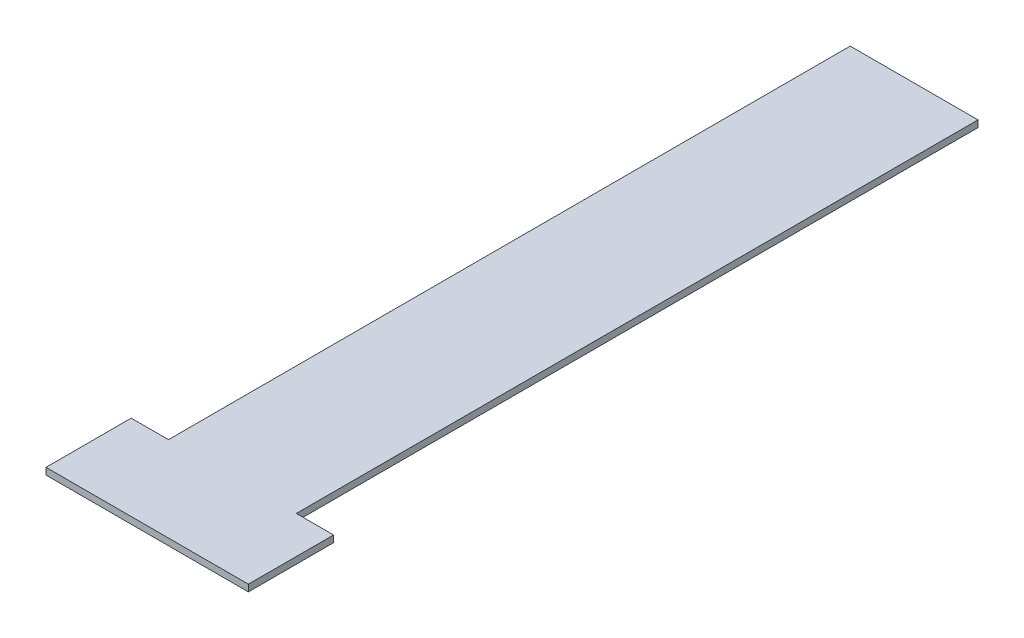
ISO-10303-21;
HEADER;
FILE_DESCRIPTION(('STEP AP214'),'2;1');
FILE_NAME('part.step','',(''),(''),'','','');
FILE_SCHEMA(('AUTOMOTIVE_DESIGN { 1 0 10303 214 1 1 1 1 }'));
ENDSEC;
DATA;
#1=APPLICATION_CONTEXT('core data for automotive mechanical design processes');
#2=APPLICATION_PROTOCOL_DEFINITION('international standard','automotive_design',2000,#1);
#3=PRODUCT_CONTEXT('',#1,'mechanical');
#4=PRODUCT('Part','Part','',(#3));
#5=PRODUCT_RELATED_PRODUCT_CATEGORY('part','',(#4));
#6=PRODUCT_DEFINITION_FORMATION('','',#4);
#7=PRODUCT_DEFINITION_CONTEXT('part definition',#1,'design');
#8=PRODUCT_DEFINITION('design','',#6,#7);
#9=PRODUCT_DEFINITION_SHAPE('','',#8);
#10=(LENGTH_UNIT() NAMED_UNIT(*) SI_UNIT(.MILLI.,.METRE.));
#11=(NAMED_UNIT(*) PLANE_ANGLE_UNIT() SI_UNIT($,.RADIAN.));
#12=(NAMED_UNIT(*) SI_UNIT($,.STERADIAN.) SOLID_ANGLE_UNIT());
#13=UNCERTAINTY_MEASURE_WITH_UNIT(LENGTH_MEASURE(1.E-05),#10,'distance_accuracy_value','');
#14=(GEOMETRIC_REPRESENTATION_CONTEXT(3) GLOBAL_UNCERTAINTY_ASSIGNED_CONTEXT((#13)) GLOBAL_UNIT_ASSIGNED_CONTEXT((#10,
#11,#12)) REPRESENTATION_CONTEXT('',''));
#15=CARTESIAN_POINT('',(0.,0.,0.));
#16=DIRECTION('',(0.,0.,1.));
#17=DIRECTION('',(1.,0.,0.));
#18=AXIS2_PLACEMENT_3D('',#15,#16,#17);
#19=CARTESIAN_POINT('',(-5.31079537855206,2.,5.04264705882353));
#20=DIRECTION('',(0.,0.,-1.));
#21=DIRECTION('',(1.,0.,0.));
#22=AXIS2_PLACEMENT_3D('',#19,#20,#21);
#23=PLANE('',#22);
#24=DIRECTION('',(1.,0.,0.));
#25=VECTOR('',#24,1.);
#26=CARTESIAN_POINT('',(-5.31079537855206,2.,5.04264705882353));
#27=LINE('',#26,#25);
#28=CARTESIAN_POINT('',(-40.2357953785521,2.,5.04264705882353));
#29=VERTEX_POINT('',#28);
#30=CARTESIAN_POINT('',(20.0892046214479,2.,5.04264705882353));
#31=VERTEX_POINT('',#30);
#32=EDGE_CURVE('E106',#29,#31,#27,.T.);
#33=ORIENTED_EDGE('',*,*,#32,.F.);
#34=DIRECTION('',(0.,1.,0.));
#35=VECTOR('',#34,1.);
#36=CARTESIAN_POINT('',(-40.2357953785521,0.,5.04264705882353));
#37=LINE('',#36,#35);
#38=CARTESIAN_POINT('',(-40.2357953785521,0.,5.04264705882353));
#39=VERTEX_POINT('',#38);
#40=EDGE_CURVE('E145',#39,#29,#37,.T.);
#41=ORIENTED_EDGE('',*,*,#40,.F.);
#42=DIRECTION('',(1.,0.,0.));
#43=VECTOR('',#42,1.);
#44=CARTESIAN_POINT('',(0.,0.,5.04264705882352));
#45=LINE('',#44,#43);
#46=CARTESIAN_POINT('',(20.0892046214479,0.,5.04264705882353));
#47=VERTEX_POINT('',#46);
#48=EDGE_CURVE('E82',#39,#47,#45,.T.);
#49=ORIENTED_EDGE('',*,*,#48,.T.);
#50=DIRECTION('',(0.,1.,0.));
#51=VECTOR('',#50,1.);
#52=CARTESIAN_POINT('',(20.0892046214479,0.,5.04264705882353));
#53=LINE('',#52,#51);
#54=EDGE_CURVE('E133',#47,#31,#53,.T.);
#55=ORIENTED_EDGE('',*,*,#54,.T.);
#56=EDGE_LOOP('',(#33,#41,#49,#55));
#57=FACE_BOUND('',#56,.T.);
#58=ADVANCED_FACE('F39',(#57),#23,.F.);
#59=CARTESIAN_POINT('',(8.97670462144793,2.,-223.557352941176));
#60=DIRECTION('',(-1.,0.,0.));
#61=DIRECTION('',(0.,0.,-1.));
#62=AXIS2_PLACEMENT_3D('',#59,#60,#61);
#63=PLANE('',#62);
#64=DIRECTION('',(0.,1.,0.));
#65=VECTOR('',#64,1.);
#66=CARTESIAN_POINT('',(8.97670462144793,2.,-20.3573529411765));
#67=LINE('',#66,#65);
#68=CARTESIAN_POINT('',(8.97670462144793,0.,-20.3573529411765));
#69=VERTEX_POINT('',#68);
#70=CARTESIAN_POINT('',(8.97670462144793,2.,-20.3573529411765));
#71=VERTEX_POINT('',#70);
#72=EDGE_CURVE('E11',#69,#71,#67,.T.);
#73=ORIENTED_EDGE('',*,*,#72,.F.);
#74=DIRECTION('',(0.,0.,-1.));
#75=VECTOR('',#74,1.);
#76=CARTESIAN_POINT('',(8.97670462144793,0.,0.));
#77=LINE('',#76,#75);
#78=CARTESIAN_POINT('',(8.97670462144793,0.,-223.557352941176));
#79=VERTEX_POINT('',#78);
#80=EDGE_CURVE('E158',#69,#79,#77,.T.);
#81=ORIENTED_EDGE('',*,*,#80,.T.);
#82=DIRECTION('',(0.,1.,0.));
#83=VECTOR('',#82,1.);
#84=CARTESIAN_POINT('',(8.97670462144793,2.,-223.557352941176));
#85=LINE('',#84,#83);
#86=CARTESIAN_POINT('',(8.97670462144793,2.,-223.557352941176));
#87=VERTEX_POINT('',#86);
#88=EDGE_CURVE('E48',#79,#87,#85,.T.);
#89=ORIENTED_EDGE('',*,*,#88,.T.);
#90=DIRECTION('',(0.,0.,-1.));
#91=VECTOR('',#90,1.);
#92=CARTESIAN_POINT('',(8.97670462144793,2.,-223.557352941176));
#93=LINE('',#92,#91);
#94=EDGE_CURVE('E99',#71,#87,#93,.T.);
#95=ORIENTED_EDGE('',*,*,#94,.F.);
#96=EDGE_LOOP('',(#73,#81,#89,#95));
#97=FACE_BOUND('',#96,.T.);
#98=ADVANCED_FACE('F100',(#97),#63,.F.);
#99=CARTESIAN_POINT('',(-29.1232953785521,2.,-223.557352941176));
#100=DIRECTION('',(0.,0.,1.));
#101=DIRECTION('',(-1.,0.,0.));
#102=AXIS2_PLACEMENT_3D('',#99,#100,#101);
#103=PLANE('',#102);
#104=ORIENTED_EDGE('',*,*,#88,.F.);
#105=DIRECTION('',(1.,0.,0.));
#106=VECTOR('',#105,1.);
#107=CARTESIAN_POINT('',(0.,0.,-223.557352941176));
#108=LINE('',#107,#106);
#109=CARTESIAN_POINT('',(-29.1232953785521,0.,-223.557352941176));
#110=VERTEX_POINT('',#109);
#111=EDGE_CURVE('E153',#79,#110,#108,.F.);
#112=ORIENTED_EDGE('',*,*,#111,.T.);
#113=DIRECTION('',(0.,1.,0.));
#114=VECTOR('',#113,1.);
#115=CARTESIAN_POINT('',(-29.1232953785521,2.,-223.557352941176));
#116=LINE('',#115,#114);
#117=CARTESIAN_POINT('',(-29.1232953785521,2.,-223.557352941176));
#118=VERTEX_POINT('',#117);
#119=EDGE_CURVE('E56',#110,#118,#116,.T.);
#120=ORIENTED_EDGE('',*,*,#119,.T.);
#121=DIRECTION('',(-1.,0.,0.));
#122=VECTOR('',#121,1.);
#123=CARTESIAN_POINT('',(-29.1232953785521,2.,-223.557352941176));
#124=LINE('',#123,#122);
#125=EDGE_CURVE('E105',#87,#118,#124,.T.);
#126=ORIENTED_EDGE('',*,*,#125,.F.);
#127=EDGE_LOOP('',(#104,#112,#120,#126));
#128=FACE_BOUND('',#127,.T.);
#129=ADVANCED_FACE('F185',(#128),#103,.F.);
#130=CARTESIAN_POINT('',(-29.1232953785521,2.,-20.3573529411765));
#131=DIRECTION('',(1.,0.,0.));
#132=DIRECTION('',(0.,0.,1.));
#133=AXIS2_PLACEMENT_3D('',#130,#131,#132);
#134=PLANE('',#133);
#135=ORIENTED_EDGE('',*,*,#119,.F.);
#136=DIRECTION('',(0.,0.,-1.));
#137=VECTOR('',#136,1.);
#138=CARTESIAN_POINT('',(-29.1232953785521,0.,0.));
#139=LINE('',#138,#137);
#140=CARTESIAN_POINT('',(-29.1232953785521,0.,-20.3573529411765));
#141=VERTEX_POINT('',#140);
#142=EDGE_CURVE('E73',#110,#141,#139,.F.);
#143=ORIENTED_EDGE('',*,*,#142,.T.);
#144=DIRECTION('',(0.,1.,0.));
#145=VECTOR('',#144,1.);
#146=CARTESIAN_POINT('',(-29.1232953785521,2.,-20.3573529411765));
#147=LINE('',#146,#145);
#148=CARTESIAN_POINT('',(-29.1232953785521,2.,-20.3573529411765));
#149=VERTEX_POINT('',#148);
#150=EDGE_CURVE('E42',#141,#149,#147,.T.);
#151=ORIENTED_EDGE('',*,*,#150,.T.);
#152=DIRECTION('',(0.,0.,1.));
#153=VECTOR('',#152,1.);
#154=CARTESIAN_POINT('',(-29.1232953785521,2.,-20.3573529411765));
#155=LINE('',#154,#153);
#156=EDGE_CURVE('E150',#118,#149,#155,.T.);
#157=ORIENTED_EDGE('',*,*,#156,.F.);
#158=EDGE_LOOP('',(#135,#143,#151,#157));
#159=FACE_BOUND('',#158,.T.);
#160=ADVANCED_FACE('F162',(#159),#134,.F.);
#161=CARTESIAN_POINT('',(0.,2.,0.));
#162=DIRECTION('',(0.,-1.,0.));
#163=DIRECTION('',(0.,0.,-1.));
#164=AXIS2_PLACEMENT_3D('',#161,#162,#163);
#165=PLANE('',#164);
#166=DIRECTION('',(0.,0.,1.));
#167=VECTOR('',#166,1.);
#168=CARTESIAN_POINT('',(-40.2357953785521,2.,-20.3573529411765));
#169=LINE('',#168,#167);
#170=CARTESIAN_POINT('',(-40.2357953785521,2.,-20.3573529411765));
#171=VERTEX_POINT('',#170);
#172=EDGE_CURVE('E139',#171,#29,#169,.T.);
#173=ORIENTED_EDGE('',*,*,#172,.T.);
#174=ORIENTED_EDGE('',*,*,#32,.T.);
#175=DIRECTION('',(0.,0.,-1.));
#176=VECTOR('',#175,1.);
#177=CARTESIAN_POINT('',(20.0892046214479,2.,-20.3573529411765));
#178=LINE('',#177,#176);
#179=CARTESIAN_POINT('',(20.0892046214479,2.,-20.3573529411765));
#180=VERTEX_POINT('',#179);
#181=EDGE_CURVE('E121',#31,#180,#178,.T.);
#182=ORIENTED_EDGE('',*,*,#181,.T.);
#183=DIRECTION('',(-1.,0.,0.));
#184=VECTOR('',#183,1.);
#185=CARTESIAN_POINT('',(-5.31079537855207,2.,-20.3573529411765));
#186=LINE('',#185,#184);
#187=EDGE_CURVE('E113',#180,#71,#186,.T.);
#188=ORIENTED_EDGE('',*,*,#187,.T.);
#189=ORIENTED_EDGE('',*,*,#94,.T.);
#190=ORIENTED_EDGE('',*,*,#125,.T.);
#191=ORIENTED_EDGE('',*,*,#156,.T.);
#192=DIRECTION('',(-1.,0.,0.));
#193=VECTOR('',#192,1.);
#194=CARTESIAN_POINT('',(-14.8357953785521,2.,-20.3573529411765));
#195=LINE('',#194,#193);
#196=EDGE_CURVE('E132',#149,#171,#195,.T.);
#197=ORIENTED_EDGE('',*,*,#196,.T.);
#198=EDGE_LOOP('',(#173,#174,#182,#188,#189,#190,#191,#197));
#199=FACE_BOUND('',#198,.T.);
#200=ADVANCED_FACE('F118',(#199),#165,.F.);
#201=CARTESIAN_POINT('',(0.,0.,0.));
#202=DIRECTION('',(0.,-1.,0.));
#203=DIRECTION('',(0.,0.,-1.));
#204=AXIS2_PLACEMENT_3D('',#201,#202,#203);
#205=PLANE('',#204);
#206=ORIENTED_EDGE('',*,*,#48,.F.);
#207=DIRECTION('',(0.,0.,1.));
#208=VECTOR('',#207,1.);
#209=CARTESIAN_POINT('',(-40.2357953785521,0.,-20.3573529411765));
#210=LINE('',#209,#208);
#211=CARTESIAN_POINT('',(-40.2357953785521,0.,-20.3573529411765));
#212=VERTEX_POINT('',#211);
#213=EDGE_CURVE('E138',#212,#39,#210,.T.);
#214=ORIENTED_EDGE('',*,*,#213,.F.);
#215=DIRECTION('',(-1.,0.,0.));
#216=VECTOR('',#215,1.);
#217=CARTESIAN_POINT('',(-14.8357953785521,0.,-20.3573529411765));
#218=LINE('',#217,#216);
#219=EDGE_CURVE('E136',#141,#212,#218,.T.);
#220=ORIENTED_EDGE('',*,*,#219,.F.);
#221=ORIENTED_EDGE('',*,*,#142,.F.);
#222=ORIENTED_EDGE('',*,*,#111,.F.);
#223=ORIENTED_EDGE('',*,*,#80,.F.);
#224=DIRECTION('',(-1.,0.,0.));
#225=VECTOR('',#224,1.);
#226=CARTESIAN_POINT('',(-5.31079537855207,0.,-20.3573529411765));
#227=LINE('',#226,#225);
#228=CARTESIAN_POINT('',(20.0892046214479,0.,-20.3573529411765));
#229=VERTEX_POINT('',#228);
#230=EDGE_CURVE('E115',#229,#69,#227,.T.);
#231=ORIENTED_EDGE('',*,*,#230,.F.);
#232=DIRECTION('',(0.,0.,-1.));
#233=VECTOR('',#232,1.);
#234=CARTESIAN_POINT('',(20.0892046214479,0.,-20.3573529411765));
#235=LINE('',#234,#233);
#236=EDGE_CURVE('E122',#47,#229,#235,.T.);
#237=ORIENTED_EDGE('',*,*,#236,.F.);
#238=EDGE_LOOP('',(#206,#214,#220,#221,#222,#223,#231,#237));
#239=FACE_BOUND('',#238,.T.);
#240=ADVANCED_FACE('F184',(#239),#205,.T.);
#241=CARTESIAN_POINT('',(-40.2357953785521,0.,-20.3573529411765));
#242=DIRECTION('',(-1.,0.,0.));
#243=DIRECTION('',(0.,0.,1.));
#244=AXIS2_PLACEMENT_3D('',#241,#242,#243);
#245=PLANE('',#244);
#246=ORIENTED_EDGE('',*,*,#172,.F.);
#247=DIRECTION('',(0.,1.,0.));
#248=VECTOR('',#247,1.);
#249=CARTESIAN_POINT('',(-40.2357953785521,0.,-20.3573529411765));
#250=LINE('',#249,#248);
#251=EDGE_CURVE('E142',#212,#171,#250,.T.);
#252=ORIENTED_EDGE('',*,*,#251,.F.);
#253=ORIENTED_EDGE('',*,*,#213,.T.);
#254=ORIENTED_EDGE('',*,*,#40,.T.);
#255=EDGE_LOOP('',(#246,#252,#253,#254));
#256=FACE_BOUND('',#255,.T.);
#257=ADVANCED_FACE('F170',(#256),#245,.T.);
#258=CARTESIAN_POINT('',(-14.8357953785521,0.,-20.3573529411765));
#259=DIRECTION('',(0.,0.,-1.));
#260=DIRECTION('',(-1.,0.,0.));
#261=AXIS2_PLACEMENT_3D('',#258,#259,#260);
#262=PLANE('',#261);
#263=ORIENTED_EDGE('',*,*,#196,.F.);
#264=ORIENTED_EDGE('',*,*,#150,.F.);
#265=ORIENTED_EDGE('',*,*,#219,.T.);
#266=ORIENTED_EDGE('',*,*,#251,.T.);
#267=EDGE_LOOP('',(#263,#264,#265,#266));
#268=FACE_BOUND('',#267,.T.);
#269=ADVANCED_FACE('F166',(#268),#262,.T.);
#270=CARTESIAN_POINT('',(-5.31079537855207,0.,-20.3573529411765));
#271=DIRECTION('',(0.,0.,-1.));
#272=DIRECTION('',(-1.,0.,0.));
#273=AXIS2_PLACEMENT_3D('',#270,#271,#272);
#274=PLANE('',#273);
#275=ORIENTED_EDGE('',*,*,#230,.T.);
#276=ORIENTED_EDGE('',*,*,#72,.T.);
#277=ORIENTED_EDGE('',*,*,#187,.F.);
#278=DIRECTION('',(0.,1.,0.));
#279=VECTOR('',#278,1.);
#280=CARTESIAN_POINT('',(20.0892046214479,0.,-20.3573529411765));
#281=LINE('',#280,#279);
#282=EDGE_CURVE('E129',#229,#180,#281,.T.);
#283=ORIENTED_EDGE('',*,*,#282,.F.);
#284=EDGE_LOOP('',(#275,#276,#277,#283));
#285=FACE_BOUND('',#284,.T.);
#286=ADVANCED_FACE('F110',(#285),#274,.T.);
#287=CARTESIAN_POINT('',(20.0892046214479,0.,-20.3573529411765));
#288=DIRECTION('',(1.,0.,0.));
#289=DIRECTION('',(0.,0.,-1.));
#290=AXIS2_PLACEMENT_3D('',#287,#288,#289);
#291=PLANE('',#290);
#292=ORIENTED_EDGE('',*,*,#181,.F.);
#293=ORIENTED_EDGE('',*,*,#54,.F.);
#294=ORIENTED_EDGE('',*,*,#236,.T.);
#295=ORIENTED_EDGE('',*,*,#282,.T.);
#296=EDGE_LOOP('',(#292,#293,#294,#295));
#297=FACE_BOUND('',#296,.T.);
#298=ADVANCED_FACE('F177',(#297),#291,.T.);
#299=CLOSED_SHELL('',(#58,#98,#129,#160,#200,#240,#257,#269,#286,#298));
#300=MANIFOLD_SOLID_BREP('B2',#299);
#301=ADVANCED_BREP_SHAPE_REPRESENTATION('',(#18,#300),#14);
#302=SHAPE_DEFINITION_REPRESENTATION(#9,#301);
ENDSEC;
END-ISO-10303-21;
